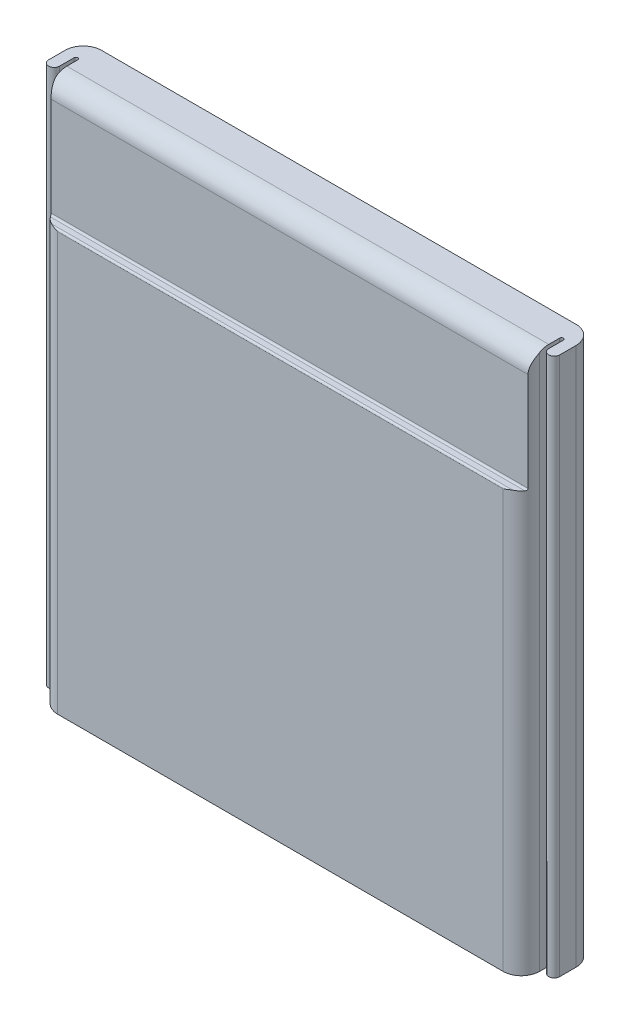
ISO-10303-21;
HEADER;
FILE_DESCRIPTION(('STEP AP214'),'2;1');
FILE_NAME('part.step','',(''),(''),'','','');
FILE_SCHEMA(('AUTOMOTIVE_DESIGN { 1 0 10303 214 1 1 1 1 }'));
ENDSEC;
DATA;
#1=APPLICATION_CONTEXT('core data for automotive mechanical design processes');
#2=APPLICATION_PROTOCOL_DEFINITION('international standard','automotive_design',2000,#1);
#3=PRODUCT_CONTEXT('',#1,'mechanical');
#4=PRODUCT('Part','Part','',(#3));
#5=PRODUCT_RELATED_PRODUCT_CATEGORY('part','',(#4));
#6=PRODUCT_DEFINITION_FORMATION('','',#4);
#7=PRODUCT_DEFINITION_CONTEXT('part definition',#1,'design');
#8=PRODUCT_DEFINITION('design','',#6,#7);
#9=PRODUCT_DEFINITION_SHAPE('','',#8);
#10=(LENGTH_UNIT() NAMED_UNIT(*) SI_UNIT(.MILLI.,.METRE.));
#11=(NAMED_UNIT(*) PLANE_ANGLE_UNIT() SI_UNIT($,.RADIAN.));
#12=(NAMED_UNIT(*) SI_UNIT($,.STERADIAN.) SOLID_ANGLE_UNIT());
#13=UNCERTAINTY_MEASURE_WITH_UNIT(LENGTH_MEASURE(1.E-05),#10,'distance_accuracy_value','');
#14=(GEOMETRIC_REPRESENTATION_CONTEXT(3) GLOBAL_UNCERTAINTY_ASSIGNED_CONTEXT((#13)) GLOBAL_UNIT_ASSIGNED_CONTEXT((#10,
#11,#12)) REPRESENTATION_CONTEXT('',''));
#15=CARTESIAN_POINT('',(0.,0.,0.));
#16=DIRECTION('',(0.,0.,1.));
#17=DIRECTION('',(1.,0.,0.));
#18=AXIS2_PLACEMENT_3D('',#15,#16,#17);
#19=CARTESIAN_POINT('',(-13.2,14.75,2.2));
#20=DIRECTION('',(1.,0.,0.));
#21=DIRECTION('',(0.,0.,-1.));
#22=AXIS2_PLACEMENT_3D('',#19,#20,#21);
#23=PLANE('',#22);
#24=CARTESIAN_POINT('',(-13.2,13.75,1.7));
#25=DIRECTION('',(1.,0.,0.));
#26=DIRECTION('',(0.,0.,-1.));
#27=AXIS2_PLACEMENT_3D('',#24,#25,#26);
#28=CIRCLE('',#27,1.);
#29=CARTESIAN_POINT('',(-13.2,14.75,1.7));
#30=VERTEX_POINT('',#29);
#31=CARTESIAN_POINT('',(-13.2,14.6160254037844,2.2));
#32=VERTEX_POINT('',#31);
#33=EDGE_CURVE('E354',#30,#32,#28,.T.);
#34=ORIENTED_EDGE('',*,*,#33,.F.);
#35=DIRECTION('',(0.,0.,1.));
#36=VECTOR('',#35,1.);
#37=CARTESIAN_POINT('',(-13.2,14.75,2.2));
#38=LINE('',#37,#36);
#39=CARTESIAN_POINT('',(-13.2,14.75,1.1));
#40=VERTEX_POINT('',#39);
#41=EDGE_CURVE('E268',#40,#30,#38,.T.);
#42=ORIENTED_EDGE('',*,*,#41,.F.);
#43=DIRECTION('',(0.,-1.,0.));
#44=VECTOR('',#43,1.);
#45=CARTESIAN_POINT('',(-13.2,14.75,1.1));
#46=LINE('',#45,#44);
#47=CARTESIAN_POINT('',(-13.2,-14.75,1.1));
#48=VERTEX_POINT('',#47);
#49=EDGE_CURVE('E236',#40,#48,#46,.T.);
#50=ORIENTED_EDGE('',*,*,#49,.T.);
#51=DIRECTION('',(0.,0.,1.));
#52=VECTOR('',#51,1.);
#53=CARTESIAN_POINT('',(-13.2,-14.75,2.2));
#54=LINE('',#53,#52);
#55=CARTESIAN_POINT('',(-13.2,-14.75,2.2));
#56=VERTEX_POINT('',#55);
#57=EDGE_CURVE('E191',#48,#56,#54,.T.);
#58=ORIENTED_EDGE('',*,*,#57,.T.);
#59=DIRECTION('',(0.,-1.,0.));
#60=VECTOR('',#59,1.);
#61=CARTESIAN_POINT('',(-13.2,14.75,2.2));
#62=LINE('',#61,#60);
#63=EDGE_CURVE('E234',#32,#56,#62,.T.);
#64=ORIENTED_EDGE('',*,*,#63,.F.);
#65=EDGE_LOOP('',(#34,#42,#50,#58,#64));
#66=FACE_BOUND('',#65,.T.);
#67=ADVANCED_FACE('F35',(#66),#23,.F.);
#68=CARTESIAN_POINT('',(-12.2,14.75,2.2));
#69=DIRECTION('',(0.,-1.,0.));
#70=DIRECTION('',(0.,0.,-1.));
#71=AXIS2_PLACEMENT_3D('',#68,#69,#70);
#72=CYLINDRICAL_SURFACE('',#71,1.);
#73=CARTESIAN_POINT('',(-12.6358898943541,8.25,3.1));
#74=CARTESIAN_POINT('',(-12.6214198627251,8.24998087573132,3.10701007655206));
#75=CARTESIAN_POINT('',(-12.6068006352163,8.249265460495,3.11365781850025));
#76=CARTESIAN_POINT('',(-12.5773690839468,8.24672262065517,3.1262002892041));
#77=CARTESIAN_POINT('',(-12.5625572084247,8.2448974387364,3.13209650769148));
#78=CARTESIAN_POINT('',(-12.5328483052413,8.2404225906742,3.1431131265884));
#79=CARTESIAN_POINT('',(-12.5179518829108,8.23777636485902,3.1482366340857));
#80=CARTESIAN_POINT('',(-12.4880458384408,8.23183451609579,3.1577452026079));
#81=CARTESIAN_POINT('',(-12.4730361502611,8.22853848071702,3.16212979134967));
#82=CARTESIAN_POINT('',(-12.4163650565092,8.21519820770311,3.17726275689995));
#83=CARTESIAN_POINT('',(-12.3744266425236,8.2035121602852,3.18558260665678));
#84=CARTESIAN_POINT('',(-12.290325698292,8.17852787413603,3.19681649533091));
#85=CARTESIAN_POINT('',(-12.2481630730274,8.16522888936416,3.19972802247117));
#86=CARTESIAN_POINT('',(-12.2040200935914,8.15127126037264,3.19999392645252));
#87=CARTESIAN_POINT('',(-12.2020100056998,8.15063561401818,3.19999998538536));
#88=CARTESIAN_POINT('',(-12.2,8.15,3.2));
#89=B_SPLINE_CURVE_WITH_KNOTS('',3,(#73,#74,#75,#76,#77,#78,#79,#80,#81,#82,#83,#84,#85,#86,#87,
#88),.UNSPECIFIED.,.F.,.F.,(4,2,2,2,2,2,2,4),(0.,0.0481832877468258,0.0962695258809041,
0.144156934372798,0.192074835171751,0.32457641351466,0.457139513943929,0.46346409540025),.UNSPECIFIED.);
#90=CARTESIAN_POINT('',(-12.6358898943541,8.25,3.1));
#91=VERTEX_POINT('',#90);
#92=CARTESIAN_POINT('',(-12.2,8.15,3.2));
#93=VERTEX_POINT('',#92);
#94=EDGE_CURVE('E446',#91,#93,#89,.T.);
#95=ORIENTED_EDGE('',*,*,#94,.F.);
#96=CARTESIAN_POINT('',(-12.2,8.25,2.2));
#97=DIRECTION('',(0.,-1.,0.));
#98=DIRECTION('',(0.,0.,-1.));
#99=AXIS2_PLACEMENT_3D('',#96,#97,#98);
#100=CIRCLE('',#99,1.);
#101=CARTESIAN_POINT('',(-13.,8.25,2.8));
#102=VERTEX_POINT('',#101);
#103=EDGE_CURVE('E439',#102,#91,#100,.F.);
#104=ORIENTED_EDGE('',*,*,#103,.F.);
#105=CARTESIAN_POINT('',(-13.0660254037844,8.35,2.7));
#106=CARTESIAN_POINT('',(-13.0660279782243,8.34494560814618,2.69999332277769));
#107=CARTESIAN_POINT('',(-13.0658044277476,8.3398960674593,2.70038274110037));
#108=CARTESIAN_POINT('',(-13.0649259336945,8.32996709622821,2.70190086023325));
#109=CARTESIAN_POINT('',(-13.0642726473069,8.32508708772544,2.70302672101017));
#110=CARTESIAN_POINT('',(-13.0625557632431,8.31561945777344,2.70596467674655));
#111=CARTESIAN_POINT('',(-13.061492407017,8.31103166611482,2.70777636787573));
#112=CARTESIAN_POINT('',(-13.0589884952015,8.30225195873243,2.71200079704115));
#113=CARTESIAN_POINT('',(-13.0575477035058,8.29806029304824,2.71441391125402));
#114=CARTESIAN_POINT('',(-13.0542591344957,8.2899840013504,2.7198575054352));
#115=CARTESIAN_POINT('',(-13.0523964562248,8.28612048115881,2.72291016379168));
#116=CARTESIAN_POINT('',(-13.0483529813228,8.27896844911962,2.72944498096114));
#117=CARTESIAN_POINT('',(-13.0461720928324,8.27568010391531,2.7329272637509));
#118=CARTESIAN_POINT('',(-13.04125432534,8.26933447588527,2.74066127698561));
#119=CARTESIAN_POINT('',(-13.0384820446391,8.26635590368266,2.74495491985005));
#120=CARTESIAN_POINT('',(-13.0326612408671,8.26115911462884,2.75380807524717));
#121=CARTESIAN_POINT('',(-13.0296124740593,8.25894157707014,2.75836782107603));
#122=CARTESIAN_POINT('',(-13.0227899730609,8.25495314029812,2.76838279745608));
#123=CARTESIAN_POINT('',(-13.0189786207917,8.25331196687665,2.77386384167033));
#124=CARTESIAN_POINT('',(-13.0111530081639,8.25099095899585,2.78487291549229));
#125=CARTESIAN_POINT('',(-13.0071389757115,8.25031006861591,2.79040088675727));
#126=CARTESIAN_POINT('',(-13.0020457153651,8.25002798534167,2.79726514123417));
#127=CARTESIAN_POINT('',(-13.0010244606521,8.24999999790555,2.79863413447215));
#128=CARTESIAN_POINT('',(-13.,8.25,2.8));
#129=B_SPLINE_CURVE_WITH_KNOTS('',3,(#105,#106,#107,#108,#109,#110,#111,#112,#113,#114,#115,
#116,#117,#118,#119,#120,#121,#122,#123,#124,#125,#126,#127,#128),.UNSPECIFIED.,.F.,.F.,(4,2,2,
2,2,2,2,2,2,2,2,4),(0.,0.0151356769404658,0.0302133257359141,0.045282110292204,
0.0603603437932048,0.0760903862274899,0.0918249785459339,0.109503090957197,0.127196941897132,
0.147744625557134,0.168269697463323,0.173393099520119),.UNSPECIFIED.);
#130=CARTESIAN_POINT('',(-13.0660254037844,8.35,2.7));
#131=VERTEX_POINT('',#130);
#132=EDGE_CURVE('E445',#131,#102,#129,.T.);
#133=ORIENTED_EDGE('',*,*,#132,.F.);
#134=DIRECTION('',(0.,-1.,0.));
#135=VECTOR('',#134,1.);
#136=CARTESIAN_POINT('',(-13.0660254037844,14.75,2.7));
#137=LINE('',#136,#135);
#138=CARTESIAN_POINT('',(-13.0660254037844,13.75,2.7));
#139=VERTEX_POINT('',#138);
#140=EDGE_CURVE('E466',#139,#131,#137,.T.);
#141=ORIENTED_EDGE('',*,*,#140,.F.);
#142=CARTESIAN_POINT('',(-13.2,14.6160254037844,2.2));
#143=CARTESIAN_POINT('',(-13.2000181305585,14.5892820915439,2.24640552944054));
#144=CARTESIAN_POINT('',(-13.1967765624243,14.5588621376335,2.29041416358912));
#145=CARTESIAN_POINT('',(-13.1858672043239,14.4919595485137,2.37250014016006));
#146=CARTESIAN_POINT('',(-13.1782280043533,14.4555171473625,2.41061379569187));
#147=CARTESIAN_POINT('',(-13.1606031151707,14.3776616928515,2.48023633738675));
#148=CARTESIAN_POINT('',(-13.1506279847263,14.3362714051419,2.51177377078733));
#149=CARTESIAN_POINT('',(-13.130262522118,14.2490711143565,2.5681165876871));
#150=CARTESIAN_POINT('',(-13.1198711576112,14.2032496652514,2.59290386962436));
#151=CARTESIAN_POINT('',(-13.0997071216149,14.103345642114,2.63724103828164));
#152=CARTESIAN_POINT('',(-13.0900948627415,14.048893542168,2.65603967151439));
#153=CARTESIAN_POINT('',(-13.0752096866402,13.9371046814502,2.6840133952902));
#154=CARTESIAN_POINT('',(-13.0699204067965,13.8797796778933,2.69322481032886));
#155=CARTESIAN_POINT('',(-13.0670234238723,13.8100861710432,2.6982664973914));
#156=CARTESIAN_POINT('',(-13.0666498056562,13.7980778423116,2.69891643928977));
#157=CARTESIAN_POINT('',(-13.066151456658,13.7740478466244,2.69978260913252));
#158=CARTESIAN_POINT('',(-13.0660265715011,13.7620261925783,2.69999910609249));
#159=CARTESIAN_POINT('',(-13.0660254037844,13.75,2.7));
#160=B_SPLINE_CURVE_WITH_KNOTS('',3,(#142,#143,#144,#145,#146,#147,#148,#149,#150,#151,#152,
#153,#154,#155,#156,#157,#158,#159),.UNSPECIFIED.,.F.,.F.,(4,2,2,2,2,2,2,2,4),(0.,
0.160068656119264,0.319108236766471,0.477442356288686,0.636196982816269,0.81050848871411,
0.984157123922422,1.02024645840394,1.05631338725672),.UNSPECIFIED.);
#161=EDGE_CURVE('E468',#32,#139,#160,.T.);
#162=ORIENTED_EDGE('',*,*,#161,.F.);
#163=ORIENTED_EDGE('',*,*,#63,.T.);
#164=CARTESIAN_POINT('',(-12.2,-14.75,2.2));
#165=DIRECTION('',(0.,1.,0.));
#166=DIRECTION('',(0.,0.,1.));
#167=AXIS2_PLACEMENT_3D('',#164,#165,#166);
#168=CIRCLE('',#167,1.);
#169=CARTESIAN_POINT('',(-12.2,-14.75,3.2));
#170=VERTEX_POINT('',#169);
#171=EDGE_CURVE('E194',#56,#170,#168,.T.);
#172=ORIENTED_EDGE('',*,*,#171,.T.);
#173=DIRECTION('',(0.,-1.,0.));
#174=VECTOR('',#173,1.);
#175=CARTESIAN_POINT('',(-12.2,14.75,3.2));
#176=LINE('',#175,#174);
#177=EDGE_CURVE('E232',#93,#170,#176,.T.);
#178=ORIENTED_EDGE('',*,*,#177,.F.);
#179=EDGE_LOOP('',(#95,#104,#133,#141,#162,#163,#172,#178));
#180=FACE_BOUND('',#179,.T.);
#181=ADVANCED_FACE('F372',(#180),#72,.T.);
#182=CARTESIAN_POINT('',(12.2,14.75,2.2));
#183=DIRECTION('',(0.,-1.,0.));
#184=DIRECTION('',(0.,0.,-1.));
#185=AXIS2_PLACEMENT_3D('',#182,#183,#184);
#186=CYLINDRICAL_SURFACE('',#185,0.999999999999999);
#187=CARTESIAN_POINT('',(12.6358898943541,8.25,3.1));
#188=CARTESIAN_POINT('',(12.6214198627251,8.24998087573132,3.10701007655207));
#189=CARTESIAN_POINT('',(12.6068006352162,8.249265460495,3.11365781850025));
#190=CARTESIAN_POINT('',(12.5773690839467,8.24672262065517,3.1262002892041));
#191=CARTESIAN_POINT('',(12.5625572084247,8.2448974387364,3.13209650769148));
#192=CARTESIAN_POINT('',(12.5328483052413,8.2404225906742,3.1431131265884));
#193=CARTESIAN_POINT('',(12.5179518829108,8.23777636485902,3.14823663408571));
#194=CARTESIAN_POINT('',(12.4880458384408,8.23183451609578,3.1577452026079));
#195=CARTESIAN_POINT('',(12.4730361502611,8.22853848071702,3.16212979134967));
#196=CARTESIAN_POINT('',(12.4163650565092,8.21519820770311,3.17726275689995));
#197=CARTESIAN_POINT('',(12.3744266425236,8.20351216028522,3.18558260665678));
#198=CARTESIAN_POINT('',(12.290325698292,8.17852787413601,3.19681649533091));
#199=CARTESIAN_POINT('',(12.2481630730275,8.16522888936408,3.19972802247117));
#200=CARTESIAN_POINT('',(12.2040200935914,8.15127126037263,3.19999392645252));
#201=CARTESIAN_POINT('',(12.2020100056998,8.15063561401818,3.19999998538536));
#202=CARTESIAN_POINT('',(12.2,8.15,3.2));
#203=B_SPLINE_CURVE_WITH_KNOTS('',3,(#187,#188,#189,#190,#191,#192,#193,#194,#195,#196,#197,
#198,#199,#200,#201,#202),.UNSPECIFIED.,.F.,.F.,(4,2,2,2,2,2,2,4),(0.,0.0481832877468335,
0.0962695258809172,0.144156934372804,0.192074835171758,0.324576413514662,0.457139513943929,
0.46346409540025),.UNSPECIFIED.);
#204=CARTESIAN_POINT('',(12.6358898943541,8.25,3.1));
#205=VERTEX_POINT('',#204);
#206=CARTESIAN_POINT('',(12.2,8.15,3.2));
#207=VERTEX_POINT('',#206);
#208=EDGE_CURVE('E326',#205,#207,#203,.T.);
#209=ORIENTED_EDGE('',*,*,#208,.T.);
#210=DIRECTION('',(0.,-1.,0.));
#211=VECTOR('',#210,1.);
#212=CARTESIAN_POINT('',(12.2,14.75,3.2));
#213=LINE('',#212,#211);
#214=CARTESIAN_POINT('',(12.2,-14.75,3.2));
#215=VERTEX_POINT('',#214);
#216=EDGE_CURVE('E230',#207,#215,#213,.T.);
#217=ORIENTED_EDGE('',*,*,#216,.T.);
#218=CARTESIAN_POINT('',(12.2,-14.75,2.2));
#219=DIRECTION('',(0.,1.,0.));
#220=DIRECTION('',(0.,0.,-1.));
#221=AXIS2_PLACEMENT_3D('',#218,#219,#220);
#222=CIRCLE('',#221,0.999999999999999);
#223=CARTESIAN_POINT('',(13.2,-14.75,2.2));
#224=VERTEX_POINT('',#223);
#225=EDGE_CURVE('E200',#215,#224,#222,.T.);
#226=ORIENTED_EDGE('',*,*,#225,.T.);
#227=DIRECTION('',(0.,-1.,0.));
#228=VECTOR('',#227,1.);
#229=CARTESIAN_POINT('',(13.2,14.75,2.2));
#230=LINE('',#229,#228);
#231=CARTESIAN_POINT('',(13.2,14.6160254037844,2.2));
#232=VERTEX_POINT('',#231);
#233=EDGE_CURVE('E228',#232,#224,#230,.T.);
#234=ORIENTED_EDGE('',*,*,#233,.F.);
#235=CARTESIAN_POINT('',(13.2,14.6160254037844,2.2));
#236=CARTESIAN_POINT('',(13.2000181305585,14.5892820915439,2.24640552944054));
#237=CARTESIAN_POINT('',(13.1967765624243,14.5588621376335,2.29041416358912));
#238=CARTESIAN_POINT('',(13.1858672043239,14.4919595485137,2.37250014016006));
#239=CARTESIAN_POINT('',(13.1782280043533,14.4555171473625,2.41061379569187));
#240=CARTESIAN_POINT('',(13.1606031151707,14.3776616928515,2.48023633738675));
#241=CARTESIAN_POINT('',(13.1506279847263,14.3362714051419,2.51177377078733));
#242=CARTESIAN_POINT('',(13.130262522118,14.2490711143565,2.5681165876871));
#243=CARTESIAN_POINT('',(13.1198711576112,14.2032496652514,2.59290386962436));
#244=CARTESIAN_POINT('',(13.0997071216149,14.103345642114,2.63724103828164));
#245=CARTESIAN_POINT('',(13.0900948627415,14.048893542168,2.65603967151439));
#246=CARTESIAN_POINT('',(13.0752096866402,13.9371046814502,2.6840133952902));
#247=CARTESIAN_POINT('',(13.0699204067965,13.8797796778933,2.69322481032886));
#248=CARTESIAN_POINT('',(13.0670234238723,13.8100861710432,2.6982664973914));
#249=CARTESIAN_POINT('',(13.0666498056562,13.7980778423116,2.69891643928977));
#250=CARTESIAN_POINT('',(13.0661514566579,13.7740478466244,2.69978260913252));
#251=CARTESIAN_POINT('',(13.0660265715011,13.7620261925783,2.69999910609249));
#252=CARTESIAN_POINT('',(13.0660254037844,13.75,2.7));
#253=B_SPLINE_CURVE_WITH_KNOTS('',3,(#235,#236,#237,#238,#239,#240,#241,#242,#243,#244,#245,
#246,#247,#248,#249,#250,#251,#252),.UNSPECIFIED.,.F.,.F.,(4,2,2,2,2,2,2,2,4),(0.,
0.160068656119265,0.319108236766473,0.477442356288689,0.636196982816271,0.810508488714111,
0.984157123922423,1.02024645840394,1.05631338725671),.UNSPECIFIED.);
#254=CARTESIAN_POINT('',(13.0660254037844,13.75,2.7));
#255=VERTEX_POINT('',#254);
#256=EDGE_CURVE('E317',#232,#255,#253,.T.);
#257=ORIENTED_EDGE('',*,*,#256,.T.);
#258=DIRECTION('',(0.,-1.,0.));
#259=VECTOR('',#258,1.);
#260=CARTESIAN_POINT('',(13.0660254037844,14.75,2.7));
#261=LINE('',#260,#259);
#262=CARTESIAN_POINT('',(13.0660254037844,8.35,2.7));
#263=VERTEX_POINT('',#262);
#264=EDGE_CURVE('E183',#255,#263,#261,.T.);
#265=ORIENTED_EDGE('',*,*,#264,.T.);
#266=CARTESIAN_POINT('',(13.0660254037844,8.35,2.7));
#267=CARTESIAN_POINT('',(13.0660279782243,8.34494560814618,2.69999332277769));
#268=CARTESIAN_POINT('',(13.0658044277476,8.3398960674593,2.70038274110037));
#269=CARTESIAN_POINT('',(13.0649259336945,8.32996709622821,2.70190086023325));
#270=CARTESIAN_POINT('',(13.0642726473069,8.32508708772544,2.70302672101017));
#271=CARTESIAN_POINT('',(13.0625557632431,8.31561945777344,2.70596467674655));
#272=CARTESIAN_POINT('',(13.061492407017,8.31103166611482,2.70777636787573));
#273=CARTESIAN_POINT('',(13.0589884952015,8.30225195873243,2.71200079704115));
#274=CARTESIAN_POINT('',(13.0575477035058,8.29806029304824,2.71441391125402));
#275=CARTESIAN_POINT('',(13.0542591344957,8.2899840013504,2.7198575054352));
#276=CARTESIAN_POINT('',(13.0523964562248,8.28612048115881,2.72291016379168));
#277=CARTESIAN_POINT('',(13.0483529813228,8.27896844911962,2.72944498096114));
#278=CARTESIAN_POINT('',(13.0461720928324,8.27568010391531,2.7329272637509));
#279=CARTESIAN_POINT('',(13.04125432534,8.26933447588527,2.74066127698561));
#280=CARTESIAN_POINT('',(13.0384820446391,8.26635590368266,2.74495491985005));
#281=CARTESIAN_POINT('',(13.0326612408671,8.26115911462884,2.75380807524717));
#282=CARTESIAN_POINT('',(13.0296124740593,8.25894157707014,2.75836782107603));
#283=CARTESIAN_POINT('',(13.0227899730609,8.25495314029812,2.76838279745608));
#284=CARTESIAN_POINT('',(13.0189786207917,8.25331196687665,2.77386384167033));
#285=CARTESIAN_POINT('',(13.0111530081639,8.25099095899585,2.78487291549229));
#286=CARTESIAN_POINT('',(13.0071389757115,8.25031006861591,2.79040088675727));
#287=CARTESIAN_POINT('',(13.0020457153651,8.25002798534167,2.79726514123417));
#288=CARTESIAN_POINT('',(13.0010244606521,8.24999999790555,2.79863413447215));
#289=CARTESIAN_POINT('',(13.,8.25,2.8));
#290=B_SPLINE_CURVE_WITH_KNOTS('',3,(#266,#267,#268,#269,#270,#271,#272,#273,#274,#275,#276,
#277,#278,#279,#280,#281,#282,#283,#284,#285,#286,#287,#288,#289),.UNSPECIFIED.,.F.,.F.,(4,2,2,
2,2,2,2,2,2,2,2,4),(0.,0.0151356769404658,0.0302133257359141,0.0452821102922017,
0.0603603437932049,0.0760903862274902,0.0918249785459343,0.109503090957197,0.127196941897132,
0.147744625557133,0.168269697463323,0.173393099520119),.UNSPECIFIED.);
#291=CARTESIAN_POINT('',(13.,8.25,2.8));
#292=VERTEX_POINT('',#291);
#293=EDGE_CURVE('E346',#263,#292,#290,.T.);
#294=ORIENTED_EDGE('',*,*,#293,.T.);
#295=CARTESIAN_POINT('',(12.2,8.25,2.2));
#296=DIRECTION('',(0.,1.,0.));
#297=DIRECTION('',(0.,0.,1.));
#298=AXIS2_PLACEMENT_3D('',#295,#296,#297);
#299=CIRCLE('',#298,0.999999999999999);
#300=EDGE_CURVE('E353',#292,#205,#299,.F.);
#301=ORIENTED_EDGE('',*,*,#300,.T.);
#302=EDGE_LOOP('',(#209,#217,#226,#234,#257,#265,#294,#301));
#303=FACE_BOUND('',#302,.T.);
#304=ADVANCED_FACE('F378',(#303),#186,.T.);
#305=CARTESIAN_POINT('',(13.2,14.75,1.10000000000001));
#306=DIRECTION('',(-1.,0.,0.));
#307=DIRECTION('',(0.,0.,1.));
#308=AXIS2_PLACEMENT_3D('',#305,#306,#307);
#309=PLANE('',#308);
#310=CARTESIAN_POINT('',(13.2,13.75,1.7));
#311=DIRECTION('',(-1.,0.,0.));
#312=DIRECTION('',(0.,0.,1.));
#313=AXIS2_PLACEMENT_3D('',#310,#311,#312);
#314=CIRCLE('',#313,1.);
#315=CARTESIAN_POINT('',(13.2,14.75,1.7));
#316=VERTEX_POINT('',#315);
#317=EDGE_CURVE('E50',#316,#232,#314,.F.);
#318=ORIENTED_EDGE('',*,*,#317,.T.);
#319=ORIENTED_EDGE('',*,*,#233,.T.);
#320=DIRECTION('',(0.,0.,-1.));
#321=VECTOR('',#320,1.);
#322=CARTESIAN_POINT('',(13.2,-14.75,1.10000000000001));
#323=LINE('',#322,#321);
#324=CARTESIAN_POINT('',(13.2,-14.75,1.10000000000001));
#325=VERTEX_POINT('',#324);
#326=EDGE_CURVE('E203',#224,#325,#323,.T.);
#327=ORIENTED_EDGE('',*,*,#326,.T.);
#328=DIRECTION('',(0.,-1.,0.));
#329=VECTOR('',#328,1.);
#330=CARTESIAN_POINT('',(13.2,14.75,1.10000000000001));
#331=LINE('',#330,#329);
#332=CARTESIAN_POINT('',(13.2,14.75,1.10000000000001));
#333=VERTEX_POINT('',#332);
#334=EDGE_CURVE('E225',#333,#325,#331,.T.);
#335=ORIENTED_EDGE('',*,*,#334,.F.);
#336=DIRECTION('',(0.,0.,-1.));
#337=VECTOR('',#336,1.);
#338=CARTESIAN_POINT('',(13.2,14.75,1.10000000000001));
#339=LINE('',#338,#337);
#340=EDGE_CURVE('E271',#316,#333,#339,.T.);
#341=ORIENTED_EDGE('',*,*,#340,.F.);
#342=EDGE_LOOP('',(#318,#319,#327,#335,#341));
#343=FACE_BOUND('',#342,.T.);
#344=ADVANCED_FACE('F395',(#343),#309,.F.);
#345=CARTESIAN_POINT('',(-13.,14.75,0.999999999999997));
#346=DIRECTION('',(0.,-1.,0.));
#347=DIRECTION('',(0.,0.,-1.));
#348=AXIS2_PLACEMENT_3D('',#345,#346,#347);
#349=CYLINDRICAL_SURFACE('',#348,0.999999999999999);
#350=CARTESIAN_POINT('',(-13.,-14.75,0.999999999999997));
#351=DIRECTION('',(0.,1.,0.));
#352=DIRECTION('',(0.,0.,1.));
#353=AXIS2_PLACEMENT_3D('',#350,#351,#352);
#354=CIRCLE('',#353,0.999999999999999);
#355=CARTESIAN_POINT('',(-13.,-14.75,0.));
#356=VERTEX_POINT('',#355);
#357=CARTESIAN_POINT('',(-14.,-14.75,1.));
#358=VERTEX_POINT('',#357);
#359=EDGE_CURVE('E179',#356,#358,#354,.T.);
#360=ORIENTED_EDGE('',*,*,#359,.T.);
#361=DIRECTION('',(0.,-1.,0.));
#362=VECTOR('',#361,1.);
#363=CARTESIAN_POINT('',(-14.,14.75,1.));
#364=LINE('',#363,#362);
#365=CARTESIAN_POINT('',(-14.,14.75,1.));
#366=VERTEX_POINT('',#365);
#367=EDGE_CURVE('E11',#366,#358,#364,.T.);
#368=ORIENTED_EDGE('',*,*,#367,.F.);
#369=CARTESIAN_POINT('',(-13.,14.75,0.999999999999997));
#370=DIRECTION('',(0.,1.,0.));
#371=DIRECTION('',(0.,0.,1.));
#372=AXIS2_PLACEMENT_3D('',#369,#370,#371);
#373=CIRCLE('',#372,0.999999999999999);
#374=CARTESIAN_POINT('',(-13.,14.75,0.));
#375=VERTEX_POINT('',#374);
#376=EDGE_CURVE('E215',#375,#366,#373,.T.);
#377=ORIENTED_EDGE('',*,*,#376,.F.);
#378=DIRECTION('',(0.,-1.,0.));
#379=VECTOR('',#378,1.);
#380=CARTESIAN_POINT('',(-13.,14.75,0.));
#381=LINE('',#380,#379);
#382=EDGE_CURVE('E175',#375,#356,#381,.T.);
#383=ORIENTED_EDGE('',*,*,#382,.T.);
#384=EDGE_LOOP('',(#360,#368,#377,#383));
#385=FACE_BOUND('',#384,.T.);
#386=ADVANCED_FACE('F37',(#385),#349,.T.);
#387=CARTESIAN_POINT('',(-14.,14.75,1.));
#388=DIRECTION('',(1.,0.,0.));
#389=DIRECTION('',(0.,0.,-1.));
#390=AXIS2_PLACEMENT_3D('',#387,#388,#389);
#391=PLANE('',#390);
#392=DIRECTION('',(0.,0.,1.));
#393=VECTOR('',#392,1.);
#394=CARTESIAN_POINT('',(-14.,-14.75,1.));
#395=LINE('',#394,#393);
#396=CARTESIAN_POINT('',(-14.,-14.75,1.9));
#397=VERTEX_POINT('',#396);
#398=EDGE_CURVE('E182',#358,#397,#395,.T.);
#399=ORIENTED_EDGE('',*,*,#398,.T.);
#400=DIRECTION('',(0.,-1.,0.));
#401=VECTOR('',#400,1.);
#402=CARTESIAN_POINT('',(-14.,14.75,1.9));
#403=LINE('',#402,#401);
#404=CARTESIAN_POINT('',(-14.,14.75,1.9));
#405=VERTEX_POINT('',#404);
#406=EDGE_CURVE('E43',#405,#397,#403,.T.);
#407=ORIENTED_EDGE('',*,*,#406,.F.);
#408=DIRECTION('',(0.,0.,1.));
#409=VECTOR('',#408,1.);
#410=CARTESIAN_POINT('',(-14.,14.75,1.));
#411=LINE('',#410,#409);
#412=EDGE_CURVE('E124',#366,#405,#411,.T.);
#413=ORIENTED_EDGE('',*,*,#412,.F.);
#414=ORIENTED_EDGE('',*,*,#367,.T.);
#415=EDGE_LOOP('',(#399,#407,#413,#414));
#416=FACE_BOUND('',#415,.T.);
#417=ADVANCED_FACE('F390',(#416),#391,.F.);
#418=CARTESIAN_POINT('',(-13.7,14.75,1.9));
#419=DIRECTION('',(0.,-1.,0.));
#420=DIRECTION('',(0.,0.,-1.));
#421=AXIS2_PLACEMENT_3D('',#418,#419,#420);
#422=CYLINDRICAL_SURFACE('',#421,0.299999999999998);
#423=CARTESIAN_POINT('',(-13.7,-14.75,1.9));
#424=DIRECTION('',(0.,1.,0.));
#425=DIRECTION('',(0.,0.,1.));
#426=AXIS2_PLACEMENT_3D('',#423,#424,#425);
#427=CIRCLE('',#426,0.299999999999998);
#428=CARTESIAN_POINT('',(-13.4,-14.75,1.9));
#429=VERTEX_POINT('',#428);
#430=EDGE_CURVE('E185',#397,#429,#427,.T.);
#431=ORIENTED_EDGE('',*,*,#430,.T.);
#432=DIRECTION('',(0.,-1.,0.));
#433=VECTOR('',#432,1.);
#434=CARTESIAN_POINT('',(-13.4,14.75,1.9));
#435=LINE('',#434,#433);
#436=CARTESIAN_POINT('',(-13.4,14.75,1.9));
#437=VERTEX_POINT('',#436);
#438=EDGE_CURVE('E242',#437,#429,#435,.T.);
#439=ORIENTED_EDGE('',*,*,#438,.F.);
#440=CARTESIAN_POINT('',(-13.7,14.75,1.9));
#441=DIRECTION('',(0.,1.,0.));
#442=DIRECTION('',(0.,0.,1.));
#443=AXIS2_PLACEMENT_3D('',#440,#441,#442);
#444=CIRCLE('',#443,0.299999999999998);
#445=EDGE_CURVE('E250',#405,#437,#444,.T.);
#446=ORIENTED_EDGE('',*,*,#445,.F.);
#447=ORIENTED_EDGE('',*,*,#406,.T.);
#448=EDGE_LOOP('',(#431,#439,#446,#447));
#449=FACE_BOUND('',#448,.T.);
#450=ADVANCED_FACE('F248',(#449),#422,.T.);
#451=CARTESIAN_POINT('',(-13.4,14.75,1.9));
#452=DIRECTION('',(-1.,0.,0.));
#453=DIRECTION('',(0.,0.,1.));
#454=AXIS2_PLACEMENT_3D('',#451,#452,#453);
#455=PLANE('',#454);
#456=DIRECTION('',(0.,0.,-1.));
#457=VECTOR('',#456,1.);
#458=CARTESIAN_POINT('',(-13.4,-14.75,1.9));
#459=LINE('',#458,#457);
#460=CARTESIAN_POINT('',(-13.4,-14.75,1.1));
#461=VERTEX_POINT('',#460);
#462=EDGE_CURVE('E187',#429,#461,#459,.T.);
#463=ORIENTED_EDGE('',*,*,#462,.T.);
#464=DIRECTION('',(0.,-1.,0.));
#465=VECTOR('',#464,1.);
#466=CARTESIAN_POINT('',(-13.4,14.75,1.1));
#467=LINE('',#466,#465);
#468=CARTESIAN_POINT('',(-13.4,14.75,1.1));
#469=VERTEX_POINT('',#468);
#470=EDGE_CURVE('E239',#469,#461,#467,.T.);
#471=ORIENTED_EDGE('',*,*,#470,.F.);
#472=DIRECTION('',(0.,0.,-1.));
#473=VECTOR('',#472,1.);
#474=CARTESIAN_POINT('',(-13.4,14.75,1.9));
#475=LINE('',#474,#473);
#476=EDGE_CURVE('E269',#437,#469,#475,.T.);
#477=ORIENTED_EDGE('',*,*,#476,.F.);
#478=ORIENTED_EDGE('',*,*,#438,.T.);
#479=EDGE_LOOP('',(#463,#471,#477,#478));
#480=FACE_BOUND('',#479,.T.);
#481=ADVANCED_FACE('F259',(#480),#455,.F.);
#482=CARTESIAN_POINT('',(-13.3,14.75,1.1));
#483=DIRECTION('',(0.,-1.,0.));
#484=DIRECTION('',(0.,0.,-1.));
#485=AXIS2_PLACEMENT_3D('',#482,#483,#484);
#486=CYLINDRICAL_SURFACE('',#485,0.100000000000001);
#487=CARTESIAN_POINT('',(-13.3,-14.75,1.1));
#488=DIRECTION('',(0.,-1.,0.));
#489=DIRECTION('',(0.,0.,1.));
#490=AXIS2_PLACEMENT_3D('',#487,#488,#489);
#491=CIRCLE('',#490,0.100000000000001);
#492=EDGE_CURVE('E189',#461,#48,#491,.T.);
#493=ORIENTED_EDGE('',*,*,#492,.T.);
#494=ORIENTED_EDGE('',*,*,#49,.F.);
#495=CARTESIAN_POINT('',(-13.3,14.75,1.1));
#496=DIRECTION('',(0.,-1.,0.));
#497=DIRECTION('',(0.,0.,1.));
#498=AXIS2_PLACEMENT_3D('',#495,#496,#497);
#499=CIRCLE('',#498,0.100000000000001);
#500=EDGE_CURVE('E265',#469,#40,#499,.T.);
#501=ORIENTED_EDGE('',*,*,#500,.F.);
#502=ORIENTED_EDGE('',*,*,#470,.T.);
#503=EDGE_LOOP('',(#493,#494,#501,#502));
#504=FACE_BOUND('',#503,.T.);
#505=ADVANCED_FACE('F263',(#504),#486,.F.);
#506=CARTESIAN_POINT('',(-12.2,14.75,3.2));
#507=DIRECTION('',(0.,0.,-1.));
#508=DIRECTION('',(-1.,0.,0.));
#509=AXIS2_PLACEMENT_3D('',#506,#507,#508);
#510=PLANE('',#509);
#511=ORIENTED_EDGE('',*,*,#216,.F.);
#512=DIRECTION('',(-1.,0.,0.));
#513=VECTOR('',#512,1.);
#514=CARTESIAN_POINT('',(14.001,8.15,3.2));
#515=LINE('',#514,#513);
#516=EDGE_CURVE('E301',#207,#93,#515,.T.);
#517=ORIENTED_EDGE('',*,*,#516,.T.);
#518=ORIENTED_EDGE('',*,*,#177,.T.);
#519=DIRECTION('',(1.,0.,0.));
#520=VECTOR('',#519,1.);
#521=CARTESIAN_POINT('',(-12.2,-14.75,3.2));
#522=LINE('',#521,#520);
#523=EDGE_CURVE('E197',#170,#215,#522,.T.);
#524=ORIENTED_EDGE('',*,*,#523,.T.);
#525=EDGE_LOOP('',(#511,#517,#518,#524));
#526=FACE_BOUND('',#525,.T.);
#527=ADVANCED_FACE('F386',(#526),#510,.F.);
#528=CARTESIAN_POINT('',(13.3,14.75,1.10000000000001));
#529=DIRECTION('',(0.,-1.,0.));
#530=DIRECTION('',(0.,0.,-1.));
#531=AXIS2_PLACEMENT_3D('',#528,#529,#530);
#532=CYLINDRICAL_SURFACE('',#531,0.0999999999999977);
#533=CARTESIAN_POINT('',(13.3,-14.75,1.10000000000001));
#534=DIRECTION('',(0.,-1.,0.));
#535=DIRECTION('',(0.,0.,-1.));
#536=AXIS2_PLACEMENT_3D('',#533,#534,#535);
#537=CIRCLE('',#536,0.0999999999999977);
#538=CARTESIAN_POINT('',(13.4,-14.75,1.10000000000001));
#539=VERTEX_POINT('',#538);
#540=EDGE_CURVE('E205',#325,#539,#537,.T.);
#541=ORIENTED_EDGE('',*,*,#540,.T.);
#542=DIRECTION('',(0.,-1.,0.));
#543=VECTOR('',#542,1.);
#544=CARTESIAN_POINT('',(13.4,14.75,1.10000000000001));
#545=LINE('',#544,#543);
#546=CARTESIAN_POINT('',(13.4,14.75,1.10000000000001));
#547=VERTEX_POINT('',#546);
#548=EDGE_CURVE('E222',#547,#539,#545,.T.);
#549=ORIENTED_EDGE('',*,*,#548,.F.);
#550=CARTESIAN_POINT('',(13.3,14.75,1.10000000000001));
#551=DIRECTION('',(0.,-1.,0.));
#552=DIRECTION('',(0.,0.,-1.));
#553=AXIS2_PLACEMENT_3D('',#550,#551,#552);
#554=CIRCLE('',#553,0.0999999999999977);
#555=EDGE_CURVE('E277',#333,#547,#554,.T.);
#556=ORIENTED_EDGE('',*,*,#555,.F.);
#557=ORIENTED_EDGE('',*,*,#334,.T.);
#558=EDGE_LOOP('',(#541,#549,#556,#557));
#559=FACE_BOUND('',#558,.T.);
#560=ADVANCED_FACE('F407',(#559),#532,.F.);
#561=CARTESIAN_POINT('',(13.4,14.75,1.90000000000002));
#562=DIRECTION('',(1.,0.,0.));
#563=DIRECTION('',(0.,0.,-1.));
#564=AXIS2_PLACEMENT_3D('',#561,#562,#563);
#565=PLANE('',#564);
#566=DIRECTION('',(0.,0.,1.));
#567=VECTOR('',#566,1.);
#568=CARTESIAN_POINT('',(13.4,-14.75,1.90000000000002));
#569=LINE('',#568,#567);
#570=CARTESIAN_POINT('',(13.4,-14.75,1.90000000000002));
#571=VERTEX_POINT('',#570);
#572=EDGE_CURVE('E207',#539,#571,#569,.T.);
#573=ORIENTED_EDGE('',*,*,#572,.T.);
#574=DIRECTION('',(0.,-1.,0.));
#575=VECTOR('',#574,1.);
#576=CARTESIAN_POINT('',(13.4,14.75,1.90000000000002));
#577=LINE('',#576,#575);
#578=CARTESIAN_POINT('',(13.4,14.75,1.90000000000002));
#579=VERTEX_POINT('',#578);
#580=EDGE_CURVE('E219',#579,#571,#577,.T.);
#581=ORIENTED_EDGE('',*,*,#580,.F.);
#582=DIRECTION('',(0.,0.,1.));
#583=VECTOR('',#582,1.);
#584=CARTESIAN_POINT('',(13.4,14.75,1.90000000000002));
#585=LINE('',#584,#583);
#586=EDGE_CURVE('E279',#547,#579,#585,.T.);
#587=ORIENTED_EDGE('',*,*,#586,.F.);
#588=ORIENTED_EDGE('',*,*,#548,.T.);
#589=EDGE_LOOP('',(#573,#581,#587,#588));
#590=FACE_BOUND('',#589,.T.);
#591=ADVANCED_FACE('F285',(#590),#565,.F.);
#592=CARTESIAN_POINT('',(13.7,14.75,1.90000000000002));
#593=DIRECTION('',(0.,-1.,0.));
#594=DIRECTION('',(0.,0.,-1.));
#595=AXIS2_PLACEMENT_3D('',#592,#593,#594);
#596=CYLINDRICAL_SURFACE('',#595,0.300000000000009);
#597=CARTESIAN_POINT('',(13.7,-14.75,1.90000000000002));
#598=DIRECTION('',(0.,1.,0.));
#599=DIRECTION('',(0.,0.,-1.));
#600=AXIS2_PLACEMENT_3D('',#597,#598,#599);
#601=CIRCLE('',#600,0.300000000000009);
#602=CARTESIAN_POINT('',(14.,-14.75,1.90000000000002));
#603=VERTEX_POINT('',#602);
#604=EDGE_CURVE('E209',#571,#603,#601,.T.);
#605=ORIENTED_EDGE('',*,*,#604,.T.);
#606=DIRECTION('',(0.,-1.,0.));
#607=VECTOR('',#606,1.);
#608=CARTESIAN_POINT('',(14.,14.75,1.90000000000002));
#609=LINE('',#608,#607);
#610=CARTESIAN_POINT('',(14.,14.75,1.90000000000002));
#611=VERTEX_POINT('',#610);
#612=EDGE_CURVE('E170',#611,#603,#609,.T.);
#613=ORIENTED_EDGE('',*,*,#612,.F.);
#614=CARTESIAN_POINT('',(13.7,14.75,1.90000000000002));
#615=DIRECTION('',(0.,1.,0.));
#616=DIRECTION('',(0.,0.,-1.));
#617=AXIS2_PLACEMENT_3D('',#614,#615,#616);
#618=CIRCLE('',#617,0.300000000000009);
#619=EDGE_CURVE('E158',#579,#611,#618,.T.);
#620=ORIENTED_EDGE('',*,*,#619,.F.);
#621=ORIENTED_EDGE('',*,*,#580,.T.);
#622=EDGE_LOOP('',(#605,#613,#620,#621));
#623=FACE_BOUND('',#622,.T.);
#624=ADVANCED_FACE('F289',(#623),#596,.T.);
#625=CARTESIAN_POINT('',(14.,14.75,1.));
#626=DIRECTION('',(-1.,0.,0.));
#627=DIRECTION('',(0.,0.,1.));
#628=AXIS2_PLACEMENT_3D('',#625,#626,#627);
#629=PLANE('',#628);
#630=DIRECTION('',(0.,0.,-1.));
#631=VECTOR('',#630,1.);
#632=CARTESIAN_POINT('',(14.,-14.75,1.));
#633=LINE('',#632,#631);
#634=CARTESIAN_POINT('',(14.,-14.75,1.));
#635=VERTEX_POINT('',#634);
#636=EDGE_CURVE('E167',#603,#635,#633,.T.);
#637=ORIENTED_EDGE('',*,*,#636,.T.);
#638=DIRECTION('',(0.,-1.,0.));
#639=VECTOR('',#638,1.);
#640=CARTESIAN_POINT('',(14.,14.75,1.));
#641=LINE('',#640,#639);
#642=CARTESIAN_POINT('',(14.,14.75,1.));
#643=VERTEX_POINT('',#642);
#644=EDGE_CURVE('E164',#643,#635,#641,.T.);
#645=ORIENTED_EDGE('',*,*,#644,.F.);
#646=DIRECTION('',(0.,0.,-1.));
#647=VECTOR('',#646,1.);
#648=CARTESIAN_POINT('',(14.,14.75,1.));
#649=LINE('',#648,#647);
#650=EDGE_CURVE('E151',#611,#643,#649,.T.);
#651=ORIENTED_EDGE('',*,*,#650,.F.);
#652=ORIENTED_EDGE('',*,*,#612,.T.);
#653=EDGE_LOOP('',(#637,#645,#651,#652));
#654=FACE_BOUND('',#653,.T.);
#655=ADVANCED_FACE('F165',(#654),#629,.F.);
#656=CARTESIAN_POINT('',(13.,14.75,1.));
#657=DIRECTION('',(0.,-1.,0.));
#658=DIRECTION('',(0.,0.,-1.));
#659=AXIS2_PLACEMENT_3D('',#656,#657,#658);
#660=CYLINDRICAL_SURFACE('',#659,1.);
#661=CARTESIAN_POINT('',(13.,-14.75,1.));
#662=DIRECTION('',(0.,1.,0.));
#663=DIRECTION('',(0.,0.,-1.));
#664=AXIS2_PLACEMENT_3D('',#661,#662,#663);
#665=CIRCLE('',#664,1.);
#666=CARTESIAN_POINT('',(13.,-14.75,0.));
#667=VERTEX_POINT('',#666);
#668=EDGE_CURVE('E212',#635,#667,#665,.T.);
#669=ORIENTED_EDGE('',*,*,#668,.T.);
#670=DIRECTION('',(0.,-1.,0.));
#671=VECTOR('',#670,1.);
#672=CARTESIAN_POINT('',(13.,14.75,0.));
#673=LINE('',#672,#671);
#674=CARTESIAN_POINT('',(13.,14.75,0.));
#675=VERTEX_POINT('',#674);
#676=EDGE_CURVE('E171',#675,#667,#673,.T.);
#677=ORIENTED_EDGE('',*,*,#676,.F.);
#678=CARTESIAN_POINT('',(13.,14.75,1.));
#679=DIRECTION('',(0.,1.,0.));
#680=DIRECTION('',(0.,0.,-1.));
#681=AXIS2_PLACEMENT_3D('',#678,#679,#680);
#682=CIRCLE('',#681,1.);
#683=EDGE_CURVE('E155',#643,#675,#682,.T.);
#684=ORIENTED_EDGE('',*,*,#683,.F.);
#685=ORIENTED_EDGE('',*,*,#644,.T.);
#686=EDGE_LOOP('',(#669,#677,#684,#685));
#687=FACE_BOUND('',#686,.T.);
#688=ADVANCED_FACE('F173',(#687),#660,.T.);
#689=CARTESIAN_POINT('',(-13.,14.75,0.));
#690=DIRECTION('',(0.,0.,1.));
#691=DIRECTION('',(1.,0.,0.));
#692=AXIS2_PLACEMENT_3D('',#689,#690,#691);
#693=PLANE('',#692);
#694=DIRECTION('',(-1.,0.,0.));
#695=VECTOR('',#694,1.);
#696=CARTESIAN_POINT('',(-13.,-14.75,0.));
#697=LINE('',#696,#695);
#698=EDGE_CURVE('E116',#667,#356,#697,.T.);
#699=ORIENTED_EDGE('',*,*,#698,.T.);
#700=ORIENTED_EDGE('',*,*,#382,.F.);
#701=DIRECTION('',(-1.,0.,0.));
#702=VECTOR('',#701,1.);
#703=CARTESIAN_POINT('',(-13.,14.75,0.));
#704=LINE('',#703,#702);
#705=EDGE_CURVE('E59',#675,#375,#704,.T.);
#706=ORIENTED_EDGE('',*,*,#705,.F.);
#707=ORIENTED_EDGE('',*,*,#676,.T.);
#708=EDGE_LOOP('',(#699,#700,#706,#707));
#709=FACE_BOUND('',#708,.T.);
#710=ADVANCED_FACE('F290',(#709),#693,.F.);
#711=CARTESIAN_POINT('',(-13.,14.75,0.999999999999997));
#712=DIRECTION('',(0.,1.,0.));
#713=DIRECTION('',(0.,0.,1.));
#714=AXIS2_PLACEMENT_3D('',#711,#712,#713);
#715=PLANE('',#714);
#716=DIRECTION('',(-1.,0.,0.));
#717=VECTOR('',#716,1.);
#718=CARTESIAN_POINT('',(14.001,14.75,1.7));
#719=LINE('',#718,#717);
#720=EDGE_CURVE('E299',#316,#30,#719,.T.);
#721=ORIENTED_EDGE('',*,*,#720,.F.);
#722=ORIENTED_EDGE('',*,*,#340,.T.);
#723=ORIENTED_EDGE('',*,*,#555,.T.);
#724=ORIENTED_EDGE('',*,*,#586,.T.);
#725=ORIENTED_EDGE('',*,*,#619,.T.);
#726=ORIENTED_EDGE('',*,*,#650,.T.);
#727=ORIENTED_EDGE('',*,*,#683,.T.);
#728=ORIENTED_EDGE('',*,*,#705,.T.);
#729=ORIENTED_EDGE('',*,*,#376,.T.);
#730=ORIENTED_EDGE('',*,*,#412,.T.);
#731=ORIENTED_EDGE('',*,*,#445,.T.);
#732=ORIENTED_EDGE('',*,*,#476,.T.);
#733=ORIENTED_EDGE('',*,*,#500,.T.);
#734=ORIENTED_EDGE('',*,*,#41,.T.);
#735=EDGE_LOOP('',(#721,#722,#723,#724,#725,#726,#727,#728,#729,#730,#731,#732,#733,#734));
#736=FACE_BOUND('',#735,.T.);
#737=ADVANCED_FACE('F153',(#736),#715,.T.);
#738=CARTESIAN_POINT('',(-13.,-14.75,0.999999999999997));
#739=DIRECTION('',(0.,1.,0.));
#740=DIRECTION('',(0.,0.,1.));
#741=AXIS2_PLACEMENT_3D('',#738,#739,#740);
#742=PLANE('',#741);
#743=ORIENTED_EDGE('',*,*,#359,.F.);
#744=ORIENTED_EDGE('',*,*,#698,.F.);
#745=ORIENTED_EDGE('',*,*,#668,.F.);
#746=ORIENTED_EDGE('',*,*,#636,.F.);
#747=ORIENTED_EDGE('',*,*,#604,.F.);
#748=ORIENTED_EDGE('',*,*,#572,.F.);
#749=ORIENTED_EDGE('',*,*,#540,.F.);
#750=ORIENTED_EDGE('',*,*,#326,.F.);
#751=ORIENTED_EDGE('',*,*,#225,.F.);
#752=ORIENTED_EDGE('',*,*,#523,.F.);
#753=ORIENTED_EDGE('',*,*,#171,.F.);
#754=ORIENTED_EDGE('',*,*,#57,.F.);
#755=ORIENTED_EDGE('',*,*,#492,.F.);
#756=ORIENTED_EDGE('',*,*,#462,.F.);
#757=ORIENTED_EDGE('',*,*,#430,.F.);
#758=ORIENTED_EDGE('',*,*,#398,.F.);
#759=EDGE_LOOP('',(#743,#744,#745,#746,#747,#748,#749,#750,#751,#752,#753,#754,#755,#756,#757,#758));
#760=FACE_BOUND('',#759,.T.);
#761=ADVANCED_FACE('F254',(#760),#742,.F.);
#762=CARTESIAN_POINT('',(14.001,13.75,2.7));
#763=DIRECTION('',(0.,0.,1.));
#764=DIRECTION('',(0.,-1.,0.));
#765=AXIS2_PLACEMENT_3D('',#762,#763,#764);
#766=PLANE('',#765);
#767=DIRECTION('',(-1.,0.,0.));
#768=VECTOR('',#767,1.);
#769=CARTESIAN_POINT('',(14.001,13.75,2.7));
#770=LINE('',#769,#768);
#771=EDGE_CURVE('E313',#255,#139,#770,.T.);
#772=ORIENTED_EDGE('',*,*,#771,.T.);
#773=ORIENTED_EDGE('',*,*,#140,.T.);
#774=DIRECTION('',(-1.,0.,0.));
#775=VECTOR('',#774,1.);
#776=CARTESIAN_POINT('',(14.001,8.35,2.7));
#777=LINE('',#776,#775);
#778=EDGE_CURVE('E310',#263,#131,#777,.T.);
#779=ORIENTED_EDGE('',*,*,#778,.F.);
#780=ORIENTED_EDGE('',*,*,#264,.F.);
#781=EDGE_LOOP('',(#772,#773,#779,#780));
#782=FACE_BOUND('',#781,.T.);
#783=ADVANCED_FACE('F341',(#782),#766,.T.);
#784=CARTESIAN_POINT('',(14.001,8.35,2.8));
#785=DIRECTION('',(-1.,0.,0.));
#786=DIRECTION('',(0.,0.,1.));
#787=AXIS2_PLACEMENT_3D('',#784,#785,#786);
#788=CYLINDRICAL_SURFACE('',#787,0.0999999999999992);
#789=ORIENTED_EDGE('',*,*,#778,.T.);
#790=ORIENTED_EDGE('',*,*,#132,.T.);
#791=DIRECTION('',(-1.,0.,0.));
#792=VECTOR('',#791,1.);
#793=CARTESIAN_POINT('',(14.001,8.25,2.8));
#794=LINE('',#793,#792);
#795=EDGE_CURVE('E307',#292,#102,#794,.T.);
#796=ORIENTED_EDGE('',*,*,#795,.F.);
#797=ORIENTED_EDGE('',*,*,#293,.F.);
#798=EDGE_LOOP('',(#789,#790,#796,#797));
#799=FACE_BOUND('',#798,.T.);
#800=ADVANCED_FACE('F356',(#799),#788,.F.);
#801=CARTESIAN_POINT('',(14.001,8.25,2.8));
#802=DIRECTION('',(0.,1.,0.));
#803=DIRECTION('',(0.,0.,1.));
#804=AXIS2_PLACEMENT_3D('',#801,#802,#803);
#805=PLANE('',#804);
#806=ORIENTED_EDGE('',*,*,#795,.T.);
#807=ORIENTED_EDGE('',*,*,#103,.T.);
#808=DIRECTION('',(-1.,0.,0.));
#809=VECTOR('',#808,1.);
#810=CARTESIAN_POINT('',(14.001,8.25,3.1));
#811=LINE('',#810,#809);
#812=EDGE_CURVE('E304',#205,#91,#811,.T.);
#813=ORIENTED_EDGE('',*,*,#812,.F.);
#814=ORIENTED_EDGE('',*,*,#300,.F.);
#815=EDGE_LOOP('',(#806,#807,#813,#814));
#816=FACE_BOUND('',#815,.T.);
#817=ADVANCED_FACE('F360',(#816),#805,.T.);
#818=CARTESIAN_POINT('',(14.001,8.15,3.1));
#819=DIRECTION('',(-1.,0.,0.));
#820=DIRECTION('',(0.,0.,1.));
#821=AXIS2_PLACEMENT_3D('',#818,#819,#820);
#822=CYLINDRICAL_SURFACE('',#821,0.1);
#823=ORIENTED_EDGE('',*,*,#812,.T.);
#824=ORIENTED_EDGE('',*,*,#94,.T.);
#825=ORIENTED_EDGE('',*,*,#516,.F.);
#826=ORIENTED_EDGE('',*,*,#208,.F.);
#827=EDGE_LOOP('',(#823,#824,#825,#826));
#828=FACE_BOUND('',#827,.T.);
#829=ADVANCED_FACE('F363',(#828),#822,.T.);
#830=CARTESIAN_POINT('',(14.001,13.75,1.7));
#831=DIRECTION('',(-1.,0.,0.));
#832=DIRECTION('',(0.,0.,1.));
#833=AXIS2_PLACEMENT_3D('',#830,#831,#832);
#834=CYLINDRICAL_SURFACE('',#833,1.);
#835=ORIENTED_EDGE('',*,*,#317,.F.);
#836=ORIENTED_EDGE('',*,*,#720,.T.);
#837=ORIENTED_EDGE('',*,*,#33,.T.);
#838=ORIENTED_EDGE('',*,*,#161,.T.);
#839=ORIENTED_EDGE('',*,*,#771,.F.);
#840=ORIENTED_EDGE('',*,*,#256,.F.);
#841=EDGE_LOOP('',(#835,#836,#837,#838,#839,#840));
#842=FACE_BOUND('',#841,.T.);
#843=ADVANCED_FACE('F333',(#842),#834,.T.);
#844=CLOSED_SHELL('',(#67,#181,#304,#344,#386,#417,#450,#481,#505,#527,#560,#591,#624,#655,#688,
#710,#737,#761,#783,#800,#817,#829,#843));
#845=MANIFOLD_SOLID_BREP('B2',#844);
#846=ADVANCED_BREP_SHAPE_REPRESENTATION('',(#18,#845),#14);
#847=SHAPE_DEFINITION_REPRESENTATION(#9,#846);
ENDSEC;
END-ISO-10303-21;
